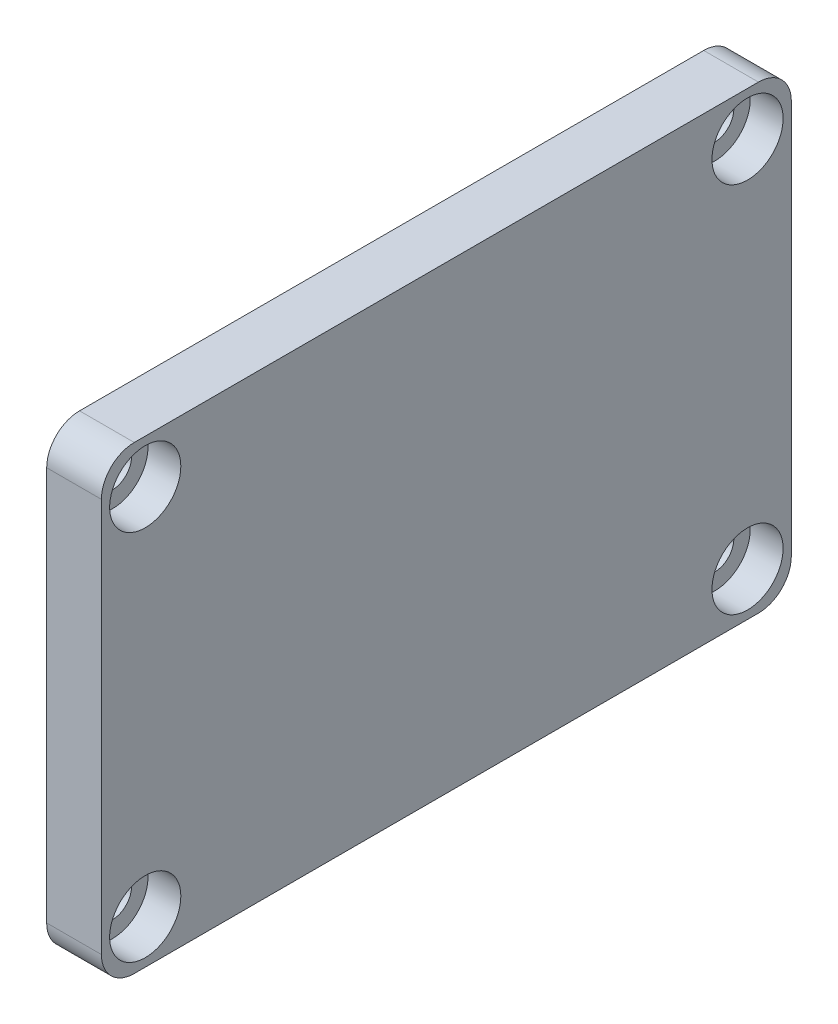
ISO-10303-21;
HEADER;
FILE_DESCRIPTION(('STEP AP214'),'2;1');
FILE_NAME('part.step','',(''),(''),'','','');
FILE_SCHEMA(('AUTOMOTIVE_DESIGN { 1 0 10303 214 1 1 1 1 }'));
ENDSEC;
DATA;
#1=APPLICATION_CONTEXT('core data for automotive mechanical design processes');
#2=APPLICATION_PROTOCOL_DEFINITION('international standard','automotive_design',2000,#1);
#3=PRODUCT_CONTEXT('',#1,'mechanical');
#4=PRODUCT('Part','Part','',(#3));
#5=PRODUCT_RELATED_PRODUCT_CATEGORY('part','',(#4));
#6=PRODUCT_DEFINITION_FORMATION('','',#4);
#7=PRODUCT_DEFINITION_CONTEXT('part definition',#1,'design');
#8=PRODUCT_DEFINITION('design','',#6,#7);
#9=PRODUCT_DEFINITION_SHAPE('','',#8);
#10=(LENGTH_UNIT() NAMED_UNIT(*) SI_UNIT(.MILLI.,.METRE.));
#11=(NAMED_UNIT(*) PLANE_ANGLE_UNIT() SI_UNIT($,.RADIAN.));
#12=(NAMED_UNIT(*) SI_UNIT($,.STERADIAN.) SOLID_ANGLE_UNIT());
#13=UNCERTAINTY_MEASURE_WITH_UNIT(LENGTH_MEASURE(1.E-05),#10,'distance_accuracy_value','');
#14=(GEOMETRIC_REPRESENTATION_CONTEXT(3) GLOBAL_UNCERTAINTY_ASSIGNED_CONTEXT((#13)) GLOBAL_UNIT_ASSIGNED_CONTEXT((#10,
#11,#12)) REPRESENTATION_CONTEXT('',''));
#15=CARTESIAN_POINT('',(0.,0.,0.));
#16=DIRECTION('',(0.,0.,1.));
#17=DIRECTION('',(1.,0.,0.));
#18=AXIS2_PLACEMENT_3D('',#15,#16,#17);
#19=CARTESIAN_POINT('',(0.,-17.,27.5));
#20=DIRECTION('',(1.,0.,0.));
#21=DIRECTION('',(0.,0.,-1.));
#22=AXIS2_PLACEMENT_3D('',#19,#20,#21);
#23=CYLINDRICAL_SURFACE('',#22,1.75);
#24=CARTESIAN_POINT('',(0.,-17.,27.5));
#25=DIRECTION('',(1.,0.,0.));
#26=DIRECTION('',(0.,0.,-1.));
#27=AXIS2_PLACEMENT_3D('',#24,#25,#26);
#28=CIRCLE('',#27,1.75);
#29=CARTESIAN_POINT('',(0.,-17.,25.75));
#30=VERTEX_POINT('',#29);
#31=EDGE_CURVE('E148',#30,#30,#28,.T.);
#32=ORIENTED_EDGE('',*,*,#31,.F.);
#33=EDGE_LOOP('',(#32));
#34=FACE_BOUND('',#33,.T.);
#35=CARTESIAN_POINT('',(2.,-17.,27.5));
#36=DIRECTION('',(1.,0.,0.));
#37=DIRECTION('',(0.,0.,-1.));
#38=AXIS2_PLACEMENT_3D('',#35,#36,#37);
#39=CIRCLE('',#38,1.75);
#40=CARTESIAN_POINT('',(2.,-17.,25.75));
#41=VERTEX_POINT('',#40);
#42=EDGE_CURVE('E50',#41,#41,#39,.F.);
#43=ORIENTED_EDGE('',*,*,#42,.F.);
#44=EDGE_LOOP('',(#43));
#45=FACE_BOUND('',#44,.T.);
#46=ADVANCED_FACE('F43',(#34,#45),#23,.F.);
#47=CARTESIAN_POINT('',(0.,17.,27.5));
#48=DIRECTION('',(1.,0.,0.));
#49=DIRECTION('',(0.,0.,-1.));
#50=AXIS2_PLACEMENT_3D('',#47,#48,#49);
#51=CYLINDRICAL_SURFACE('',#50,1.75);
#52=CARTESIAN_POINT('',(0.,17.,27.5));
#53=DIRECTION('',(1.,0.,0.));
#54=DIRECTION('',(0.,0.,-1.));
#55=AXIS2_PLACEMENT_3D('',#52,#53,#54);
#56=CIRCLE('',#55,1.75);
#57=CARTESIAN_POINT('',(0.,17.,25.75));
#58=VERTEX_POINT('',#57);
#59=EDGE_CURVE('E188',#58,#58,#56,.T.);
#60=ORIENTED_EDGE('',*,*,#59,.F.);
#61=EDGE_LOOP('',(#60));
#62=FACE_BOUND('',#61,.T.);
#63=CARTESIAN_POINT('',(2.,17.,27.5));
#64=DIRECTION('',(1.,0.,0.));
#65=DIRECTION('',(0.,0.,-1.));
#66=AXIS2_PLACEMENT_3D('',#63,#64,#65);
#67=CIRCLE('',#66,1.75);
#68=CARTESIAN_POINT('',(2.,17.,25.75));
#69=VERTEX_POINT('',#68);
#70=EDGE_CURVE('E172',#69,#69,#67,.F.);
#71=ORIENTED_EDGE('',*,*,#70,.F.);
#72=EDGE_LOOP('',(#71));
#73=FACE_BOUND('',#72,.T.);
#74=ADVANCED_FACE('F227',(#62,#73),#51,.F.);
#75=CARTESIAN_POINT('',(0.,17.,-27.5));
#76=DIRECTION('',(1.,0.,0.));
#77=DIRECTION('',(0.,0.,-1.));
#78=AXIS2_PLACEMENT_3D('',#75,#76,#77);
#79=CYLINDRICAL_SURFACE('',#78,1.75);
#80=CARTESIAN_POINT('',(0.,17.,-27.5));
#81=DIRECTION('',(1.,0.,0.));
#82=DIRECTION('',(0.,0.,-1.));
#83=AXIS2_PLACEMENT_3D('',#80,#81,#82);
#84=CIRCLE('',#83,1.75);
#85=CARTESIAN_POINT('',(0.,17.,-29.25));
#86=VERTEX_POINT('',#85);
#87=EDGE_CURVE('E184',#86,#86,#84,.T.);
#88=ORIENTED_EDGE('',*,*,#87,.F.);
#89=EDGE_LOOP('',(#88));
#90=FACE_BOUND('',#89,.T.);
#91=CARTESIAN_POINT('',(2.,17.,-27.5));
#92=DIRECTION('',(1.,0.,0.));
#93=DIRECTION('',(0.,0.,-1.));
#94=AXIS2_PLACEMENT_3D('',#91,#92,#93);
#95=CIRCLE('',#94,1.75);
#96=CARTESIAN_POINT('',(2.,17.,-29.25));
#97=VERTEX_POINT('',#96);
#98=EDGE_CURVE('E171',#97,#97,#95,.F.);
#99=ORIENTED_EDGE('',*,*,#98,.F.);
#100=EDGE_LOOP('',(#99));
#101=FACE_BOUND('',#100,.T.);
#102=ADVANCED_FACE('F237',(#90,#101),#79,.F.);
#103=CARTESIAN_POINT('',(0.,-17.,-27.5));
#104=DIRECTION('',(1.,0.,0.));
#105=DIRECTION('',(0.,0.,-1.));
#106=AXIS2_PLACEMENT_3D('',#103,#104,#105);
#107=CYLINDRICAL_SURFACE('',#106,1.75);
#108=CARTESIAN_POINT('',(0.,-17.,-27.5));
#109=DIRECTION('',(1.,0.,0.));
#110=DIRECTION('',(0.,0.,-1.));
#111=AXIS2_PLACEMENT_3D('',#108,#109,#110);
#112=CIRCLE('',#111,1.75);
#113=CARTESIAN_POINT('',(0.,-17.,-29.25));
#114=VERTEX_POINT('',#113);
#115=EDGE_CURVE('E178',#114,#114,#112,.T.);
#116=ORIENTED_EDGE('',*,*,#115,.F.);
#117=EDGE_LOOP('',(#116));
#118=FACE_BOUND('',#117,.T.);
#119=CARTESIAN_POINT('',(2.,-17.,-27.5));
#120=DIRECTION('',(1.,0.,0.));
#121=DIRECTION('',(0.,0.,-1.));
#122=AXIS2_PLACEMENT_3D('',#119,#120,#121);
#123=CIRCLE('',#122,1.75);
#124=CARTESIAN_POINT('',(2.,-17.,-29.25));
#125=VERTEX_POINT('',#124);
#126=EDGE_CURVE('E166',#125,#125,#123,.F.);
#127=ORIENTED_EDGE('',*,*,#126,.F.);
#128=EDGE_LOOP('',(#127));
#129=FACE_BOUND('',#128,.T.);
#130=ADVANCED_FACE('F241',(#118,#129),#107,.F.);
#131=CARTESIAN_POINT('',(5.,18.,28.5));
#132=DIRECTION('',(-1.,0.,0.));
#133=DIRECTION('',(0.,0.,1.));
#134=AXIS2_PLACEMENT_3D('',#131,#132,#133);
#135=CYLINDRICAL_SURFACE('',#134,3.);
#136=CARTESIAN_POINT('',(0.,18.,28.5));
#137=DIRECTION('',(1.,0.,0.));
#138=DIRECTION('',(0.,0.,-1.));
#139=AXIS2_PLACEMENT_3D('',#136,#137,#138);
#140=CIRCLE('',#139,3.);
#141=CARTESIAN_POINT('',(0.,21.,28.5));
#142=VERTEX_POINT('',#141);
#143=CARTESIAN_POINT('',(0.,18.,31.5));
#144=VERTEX_POINT('',#143);
#145=EDGE_CURVE('E142',#142,#144,#140,.T.);
#146=ORIENTED_EDGE('',*,*,#145,.T.);
#147=DIRECTION('',(-1.,0.,0.));
#148=VECTOR('',#147,1.);
#149=CARTESIAN_POINT('',(5.,18.,31.5));
#150=LINE('',#149,#148);
#151=CARTESIAN_POINT('',(5.,18.,31.5));
#152=VERTEX_POINT('',#151);
#153=EDGE_CURVE('E11',#152,#144,#150,.T.);
#154=ORIENTED_EDGE('',*,*,#153,.F.);
#155=CARTESIAN_POINT('',(5.,18.,28.5));
#156=DIRECTION('',(1.,0.,0.));
#157=DIRECTION('',(0.,0.,-1.));
#158=AXIS2_PLACEMENT_3D('',#155,#156,#157);
#159=CIRCLE('',#158,3.);
#160=CARTESIAN_POINT('',(5.,21.,28.5));
#161=VERTEX_POINT('',#160);
#162=EDGE_CURVE('E160',#161,#152,#159,.T.);
#163=ORIENTED_EDGE('',*,*,#162,.F.);
#164=DIRECTION('',(-1.,0.,0.));
#165=VECTOR('',#164,1.);
#166=CARTESIAN_POINT('',(5.,21.,28.5));
#167=LINE('',#166,#165);
#168=EDGE_CURVE('E139',#161,#142,#167,.T.);
#169=ORIENTED_EDGE('',*,*,#168,.T.);
#170=EDGE_LOOP('',(#146,#154,#163,#169));
#171=FACE_BOUND('',#170,.T.);
#172=ADVANCED_FACE('F44',(#171),#135,.T.);
#173=CARTESIAN_POINT('',(5.,-18.,31.5));
#174=DIRECTION('',(0.,0.,-1.));
#175=DIRECTION('',(-1.,0.,0.));
#176=AXIS2_PLACEMENT_3D('',#173,#174,#175);
#177=PLANE('',#176);
#178=DIRECTION('',(0.,-1.,0.));
#179=VECTOR('',#178,1.);
#180=CARTESIAN_POINT('',(0.,-18.,31.5));
#181=LINE('',#180,#179);
#182=CARTESIAN_POINT('',(0.,-18.,31.5));
#183=VERTEX_POINT('',#182);
#184=EDGE_CURVE('E144',#144,#183,#181,.T.);
#185=ORIENTED_EDGE('',*,*,#184,.T.);
#186=DIRECTION('',(-1.,0.,0.));
#187=VECTOR('',#186,1.);
#188=CARTESIAN_POINT('',(5.,-18.,31.5));
#189=LINE('',#188,#187);
#190=CARTESIAN_POINT('',(5.,-18.,31.5));
#191=VERTEX_POINT('',#190);
#192=EDGE_CURVE('E52',#191,#183,#189,.T.);
#193=ORIENTED_EDGE('',*,*,#192,.F.);
#194=DIRECTION('',(0.,-1.,0.));
#195=VECTOR('',#194,1.);
#196=CARTESIAN_POINT('',(5.,-18.,31.5));
#197=LINE('',#196,#195);
#198=EDGE_CURVE('E104',#152,#191,#197,.T.);
#199=ORIENTED_EDGE('',*,*,#198,.F.);
#200=ORIENTED_EDGE('',*,*,#153,.T.);
#201=EDGE_LOOP('',(#185,#193,#199,#200));
#202=FACE_BOUND('',#201,.T.);
#203=ADVANCED_FACE('F444',(#202),#177,.F.);
#204=CARTESIAN_POINT('',(5.,-18.,28.5));
#205=DIRECTION('',(-1.,0.,0.));
#206=DIRECTION('',(0.,0.,1.));
#207=AXIS2_PLACEMENT_3D('',#204,#205,#206);
#208=CYLINDRICAL_SURFACE('',#207,3.);
#209=CARTESIAN_POINT('',(0.,-18.,28.5));
#210=DIRECTION('',(1.,0.,0.));
#211=DIRECTION('',(0.,0.,1.));
#212=AXIS2_PLACEMENT_3D('',#209,#210,#211);
#213=CIRCLE('',#212,3.);
#214=CARTESIAN_POINT('',(0.,-21.,28.5));
#215=VERTEX_POINT('',#214);
#216=EDGE_CURVE('E146',#183,#215,#213,.T.);
#217=ORIENTED_EDGE('',*,*,#216,.T.);
#218=DIRECTION('',(-1.,0.,0.));
#219=VECTOR('',#218,1.);
#220=CARTESIAN_POINT('',(5.,-21.,28.5));
#221=LINE('',#220,#219);
#222=CARTESIAN_POINT('',(5.,-21.,28.5));
#223=VERTEX_POINT('',#222);
#224=EDGE_CURVE('E163',#223,#215,#221,.T.);
#225=ORIENTED_EDGE('',*,*,#224,.F.);
#226=CARTESIAN_POINT('',(5.,-18.,28.5));
#227=DIRECTION('',(1.,0.,0.));
#228=DIRECTION('',(0.,0.,1.));
#229=AXIS2_PLACEMENT_3D('',#226,#227,#228);
#230=CIRCLE('',#229,3.);
#231=EDGE_CURVE('E197',#191,#223,#230,.T.);
#232=ORIENTED_EDGE('',*,*,#231,.F.);
#233=ORIENTED_EDGE('',*,*,#192,.T.);
#234=EDGE_LOOP('',(#217,#225,#232,#233));
#235=FACE_BOUND('',#234,.T.);
#236=ADVANCED_FACE('F432',(#235),#208,.T.);
#237=CARTESIAN_POINT('',(5.,-21.,-28.5));
#238=DIRECTION('',(0.,1.,0.));
#239=DIRECTION('',(0.,0.,1.));
#240=AXIS2_PLACEMENT_3D('',#237,#238,#239);
#241=PLANE('',#240);
#242=DIRECTION('',(0.,0.,-1.));
#243=VECTOR('',#242,1.);
#244=CARTESIAN_POINT('',(0.,-21.,-28.5));
#245=LINE('',#244,#243);
#246=CARTESIAN_POINT('',(0.,-21.,-28.5));
#247=VERTEX_POINT('',#246);
#248=EDGE_CURVE('E147',#215,#247,#245,.T.);
#249=ORIENTED_EDGE('',*,*,#248,.T.);
#250=DIRECTION('',(-1.,0.,0.));
#251=VECTOR('',#250,1.);
#252=CARTESIAN_POINT('',(5.,-21.,-28.5));
#253=LINE('',#252,#251);
#254=CARTESIAN_POINT('',(5.,-21.,-28.5));
#255=VERTEX_POINT('',#254);
#256=EDGE_CURVE('E161',#255,#247,#253,.T.);
#257=ORIENTED_EDGE('',*,*,#256,.F.);
#258=DIRECTION('',(0.,0.,-1.));
#259=VECTOR('',#258,1.);
#260=CARTESIAN_POINT('',(5.,-21.,-28.5));
#261=LINE('',#260,#259);
#262=EDGE_CURVE('E200',#223,#255,#261,.T.);
#263=ORIENTED_EDGE('',*,*,#262,.F.);
#264=ORIENTED_EDGE('',*,*,#224,.T.);
#265=EDGE_LOOP('',(#249,#257,#263,#264));
#266=FACE_BOUND('',#265,.T.);
#267=ADVANCED_FACE('F202',(#266),#241,.F.);
#268=CARTESIAN_POINT('',(5.,-18.,-28.5));
#269=DIRECTION('',(-1.,0.,0.));
#270=DIRECTION('',(0.,0.,1.));
#271=AXIS2_PLACEMENT_3D('',#268,#269,#270);
#272=CYLINDRICAL_SURFACE('',#271,3.);
#273=CARTESIAN_POINT('',(0.,-18.,-28.5));
#274=DIRECTION('',(1.,0.,0.));
#275=DIRECTION('',(0.,0.,1.));
#276=AXIS2_PLACEMENT_3D('',#273,#274,#275);
#277=CIRCLE('',#276,3.);
#278=CARTESIAN_POINT('',(0.,-18.,-31.5));
#279=VERTEX_POINT('',#278);
#280=EDGE_CURVE('E155',#247,#279,#277,.T.);
#281=ORIENTED_EDGE('',*,*,#280,.T.);
#282=DIRECTION('',(-1.,0.,0.));
#283=VECTOR('',#282,1.);
#284=CARTESIAN_POINT('',(5.,-18.,-31.5));
#285=LINE('',#284,#283);
#286=CARTESIAN_POINT('',(5.,-18.,-31.5));
#287=VERTEX_POINT('',#286);
#288=EDGE_CURVE('E135',#287,#279,#285,.T.);
#289=ORIENTED_EDGE('',*,*,#288,.F.);
#290=CARTESIAN_POINT('',(5.,-18.,-28.5));
#291=DIRECTION('',(1.,0.,0.));
#292=DIRECTION('',(0.,0.,1.));
#293=AXIS2_PLACEMENT_3D('',#290,#291,#292);
#294=CIRCLE('',#293,3.);
#295=EDGE_CURVE('E121',#255,#287,#294,.T.);
#296=ORIENTED_EDGE('',*,*,#295,.F.);
#297=ORIENTED_EDGE('',*,*,#256,.T.);
#298=EDGE_LOOP('',(#281,#289,#296,#297));
#299=FACE_BOUND('',#298,.T.);
#300=ADVANCED_FACE('F207',(#299),#272,.T.);
#301=CARTESIAN_POINT('',(5.,-18.,-31.5));
#302=DIRECTION('',(0.,0.,1.));
#303=DIRECTION('',(1.,0.,0.));
#304=AXIS2_PLACEMENT_3D('',#301,#302,#303);
#305=PLANE('',#304);
#306=DIRECTION('',(0.,1.,0.));
#307=VECTOR('',#306,1.);
#308=CARTESIAN_POINT('',(0.,-18.,-31.5));
#309=LINE('',#308,#307);
#310=CARTESIAN_POINT('',(0.,18.,-31.5));
#311=VERTEX_POINT('',#310);
#312=EDGE_CURVE('E131',#279,#311,#309,.T.);
#313=ORIENTED_EDGE('',*,*,#312,.T.);
#314=DIRECTION('',(-1.,0.,0.));
#315=VECTOR('',#314,1.);
#316=CARTESIAN_POINT('',(5.,18.,-31.5));
#317=LINE('',#316,#315);
#318=CARTESIAN_POINT('',(5.,18.,-31.5));
#319=VERTEX_POINT('',#318);
#320=EDGE_CURVE('E129',#319,#311,#317,.T.);
#321=ORIENTED_EDGE('',*,*,#320,.F.);
#322=DIRECTION('',(0.,1.,0.));
#323=VECTOR('',#322,1.);
#324=CARTESIAN_POINT('',(5.,-18.,-31.5));
#325=LINE('',#324,#323);
#326=EDGE_CURVE('E120',#287,#319,#325,.T.);
#327=ORIENTED_EDGE('',*,*,#326,.F.);
#328=ORIENTED_EDGE('',*,*,#288,.T.);
#329=EDGE_LOOP('',(#313,#321,#327,#328));
#330=FACE_BOUND('',#329,.T.);
#331=ADVANCED_FACE('F128',(#330),#305,.F.);
#332=CARTESIAN_POINT('',(5.,18.,-28.5));
#333=DIRECTION('',(-1.,0.,0.));
#334=DIRECTION('',(0.,0.,1.));
#335=AXIS2_PLACEMENT_3D('',#332,#333,#334);
#336=CYLINDRICAL_SURFACE('',#335,3.);
#337=CARTESIAN_POINT('',(0.,18.,-28.5));
#338=DIRECTION('',(1.,0.,0.));
#339=DIRECTION('',(0.,0.,-1.));
#340=AXIS2_PLACEMENT_3D('',#337,#338,#339);
#341=CIRCLE('',#340,3.);
#342=CARTESIAN_POINT('',(0.,21.,-28.5));
#343=VERTEX_POINT('',#342);
#344=EDGE_CURVE('E93',#311,#343,#341,.T.);
#345=ORIENTED_EDGE('',*,*,#344,.T.);
#346=DIRECTION('',(-1.,0.,0.));
#347=VECTOR('',#346,1.);
#348=CARTESIAN_POINT('',(5.,21.,-28.5));
#349=LINE('',#348,#347);
#350=CARTESIAN_POINT('',(5.,21.,-28.5));
#351=VERTEX_POINT('',#350);
#352=EDGE_CURVE('E133',#351,#343,#349,.T.);
#353=ORIENTED_EDGE('',*,*,#352,.F.);
#354=CARTESIAN_POINT('',(5.,18.,-28.5));
#355=DIRECTION('',(1.,0.,0.));
#356=DIRECTION('',(0.,0.,-1.));
#357=AXIS2_PLACEMENT_3D('',#354,#355,#356);
#358=CIRCLE('',#357,3.);
#359=EDGE_CURVE('E125',#319,#351,#358,.T.);
#360=ORIENTED_EDGE('',*,*,#359,.F.);
#361=ORIENTED_EDGE('',*,*,#320,.T.);
#362=EDGE_LOOP('',(#345,#353,#360,#361));
#363=FACE_BOUND('',#362,.T.);
#364=ADVANCED_FACE('F137',(#363),#336,.T.);
#365=CARTESIAN_POINT('',(5.,21.,-28.5));
#366=DIRECTION('',(0.,-1.,0.));
#367=DIRECTION('',(0.,0.,-1.));
#368=AXIS2_PLACEMENT_3D('',#365,#366,#367);
#369=PLANE('',#368);
#370=DIRECTION('',(0.,0.,1.));
#371=VECTOR('',#370,1.);
#372=CARTESIAN_POINT('',(0.,21.,-28.5));
#373=LINE('',#372,#371);
#374=EDGE_CURVE('E100',#343,#142,#373,.T.);
#375=ORIENTED_EDGE('',*,*,#374,.T.);
#376=ORIENTED_EDGE('',*,*,#168,.F.);
#377=DIRECTION('',(0.,0.,1.));
#378=VECTOR('',#377,1.);
#379=CARTESIAN_POINT('',(5.,21.,-28.5));
#380=LINE('',#379,#378);
#381=EDGE_CURVE('E61',#351,#161,#380,.T.);
#382=ORIENTED_EDGE('',*,*,#381,.F.);
#383=ORIENTED_EDGE('',*,*,#352,.T.);
#384=EDGE_LOOP('',(#375,#376,#382,#383));
#385=FACE_BOUND('',#384,.T.);
#386=ADVANCED_FACE('F220',(#385),#369,.F.);
#387=CARTESIAN_POINT('',(5.,18.,28.5));
#388=DIRECTION('',(1.,0.,0.));
#389=DIRECTION('',(0.,0.,-1.));
#390=AXIS2_PLACEMENT_3D('',#387,#388,#389);
#391=PLANE('',#390);
#392=CARTESIAN_POINT('',(5.,17.,-27.5));
#393=DIRECTION('',(1.,0.,0.));
#394=DIRECTION('',(0.,0.,-1.));
#395=AXIS2_PLACEMENT_3D('',#392,#393,#394);
#396=CIRCLE('',#395,3.25);
#397=CARTESIAN_POINT('',(5.,17.,-30.75));
#398=VERTEX_POINT('',#397);
#399=EDGE_CURVE('E261',#398,#398,#396,.T.);
#400=ORIENTED_EDGE('',*,*,#399,.F.);
#401=EDGE_LOOP('',(#400));
#402=FACE_BOUND('',#401,.T.);
#403=CARTESIAN_POINT('',(5.,-17.,27.5));
#404=DIRECTION('',(1.,0.,0.));
#405=DIRECTION('',(0.,0.,-1.));
#406=AXIS2_PLACEMENT_3D('',#403,#404,#405);
#407=CIRCLE('',#406,3.25);
#408=CARTESIAN_POINT('',(5.,-17.,24.25));
#409=VERTEX_POINT('',#408);
#410=EDGE_CURVE('E270',#409,#409,#407,.T.);
#411=ORIENTED_EDGE('',*,*,#410,.F.);
#412=EDGE_LOOP('',(#411));
#413=FACE_BOUND('',#412,.T.);
#414=CARTESIAN_POINT('',(5.,-17.,-27.5));
#415=DIRECTION('',(1.,0.,0.));
#416=DIRECTION('',(0.,0.,-1.));
#417=AXIS2_PLACEMENT_3D('',#414,#415,#416);
#418=CIRCLE('',#417,3.25);
#419=CARTESIAN_POINT('',(5.,-17.,-30.75));
#420=VERTEX_POINT('',#419);
#421=EDGE_CURVE('E268',#420,#420,#418,.T.);
#422=ORIENTED_EDGE('',*,*,#421,.F.);
#423=EDGE_LOOP('',(#422));
#424=FACE_BOUND('',#423,.T.);
#425=CARTESIAN_POINT('',(5.,17.,27.5));
#426=DIRECTION('',(1.,0.,0.));
#427=DIRECTION('',(0.,0.,-1.));
#428=AXIS2_PLACEMENT_3D('',#425,#426,#427);
#429=CIRCLE('',#428,3.25);
#430=CARTESIAN_POINT('',(5.,17.,24.25));
#431=VERTEX_POINT('',#430);
#432=EDGE_CURVE('E256',#431,#431,#429,.T.);
#433=ORIENTED_EDGE('',*,*,#432,.F.);
#434=EDGE_LOOP('',(#433));
#435=FACE_BOUND('',#434,.T.);
#436=ORIENTED_EDGE('',*,*,#162,.T.);
#437=ORIENTED_EDGE('',*,*,#198,.T.);
#438=ORIENTED_EDGE('',*,*,#231,.T.);
#439=ORIENTED_EDGE('',*,*,#262,.T.);
#440=ORIENTED_EDGE('',*,*,#295,.T.);
#441=ORIENTED_EDGE('',*,*,#326,.T.);
#442=ORIENTED_EDGE('',*,*,#359,.T.);
#443=ORIENTED_EDGE('',*,*,#381,.T.);
#444=EDGE_LOOP('',(#436,#437,#438,#439,#440,#441,#442,#443));
#445=FACE_BOUND('',#444,.T.);
#446=ADVANCED_FACE('F117',(#402,#413,#424,#435,#445),#391,.T.);
#447=CARTESIAN_POINT('',(0.,18.,28.5));
#448=DIRECTION('',(1.,0.,0.));
#449=DIRECTION('',(0.,0.,-1.));
#450=AXIS2_PLACEMENT_3D('',#447,#448,#449);
#451=PLANE('',#450);
#452=ORIENTED_EDGE('',*,*,#115,.T.);
#453=EDGE_LOOP('',(#452));
#454=FACE_BOUND('',#453,.T.);
#455=ORIENTED_EDGE('',*,*,#87,.T.);
#456=EDGE_LOOP('',(#455));
#457=FACE_BOUND('',#456,.T.);
#458=ORIENTED_EDGE('',*,*,#59,.T.);
#459=EDGE_LOOP('',(#458));
#460=FACE_BOUND('',#459,.T.);
#461=ORIENTED_EDGE('',*,*,#31,.T.);
#462=EDGE_LOOP('',(#461));
#463=FACE_BOUND('',#462,.T.);
#464=ORIENTED_EDGE('',*,*,#145,.F.);
#465=ORIENTED_EDGE('',*,*,#374,.F.);
#466=ORIENTED_EDGE('',*,*,#344,.F.);
#467=ORIENTED_EDGE('',*,*,#312,.F.);
#468=ORIENTED_EDGE('',*,*,#280,.F.);
#469=ORIENTED_EDGE('',*,*,#248,.F.);
#470=ORIENTED_EDGE('',*,*,#216,.F.);
#471=ORIENTED_EDGE('',*,*,#184,.F.);
#472=EDGE_LOOP('',(#464,#465,#466,#467,#468,#469,#470,#471));
#473=FACE_BOUND('',#472,.T.);
#474=ADVANCED_FACE('F215',(#454,#457,#460,#463,#473),#451,.F.);
#475=CARTESIAN_POINT('',(2.,-17.,-27.5));
#476=DIRECTION('',(1.,0.,0.));
#477=DIRECTION('',(0.,0.,-1.));
#478=AXIS2_PLACEMENT_3D('',#475,#476,#477);
#479=PLANE('',#478);
#480=CARTESIAN_POINT('',(2.,-17.,-27.5));
#481=DIRECTION('',(1.,0.,0.));
#482=DIRECTION('',(0.,0.,-1.));
#483=AXIS2_PLACEMENT_3D('',#480,#481,#482);
#484=CIRCLE('',#483,3.25);
#485=CARTESIAN_POINT('',(2.,-17.,-30.75));
#486=VERTEX_POINT('',#485);
#487=EDGE_CURVE('E277',#486,#486,#484,.T.);
#488=ORIENTED_EDGE('',*,*,#487,.T.);
#489=EDGE_LOOP('',(#488));
#490=FACE_BOUND('',#489,.T.);
#491=ORIENTED_EDGE('',*,*,#126,.T.);
#492=EDGE_LOOP('',(#491));
#493=FACE_BOUND('',#492,.T.);
#494=ADVANCED_FACE('F243',(#490,#493),#479,.T.);
#495=CARTESIAN_POINT('',(2.,-17.,-27.5));
#496=DIRECTION('',(1.,0.,0.));
#497=DIRECTION('',(0.,0.,-1.));
#498=AXIS2_PLACEMENT_3D('',#495,#496,#497);
#499=CYLINDRICAL_SURFACE('',#498,3.25);
#500=ORIENTED_EDGE('',*,*,#487,.F.);
#501=EDGE_LOOP('',(#500));
#502=FACE_BOUND('',#501,.T.);
#503=ORIENTED_EDGE('',*,*,#421,.T.);
#504=EDGE_LOOP('',(#503));
#505=FACE_BOUND('',#504,.T.);
#506=ADVANCED_FACE('F249',(#502,#505),#499,.F.);
#507=CARTESIAN_POINT('',(2.,17.,-27.5));
#508=DIRECTION('',(1.,0.,0.));
#509=DIRECTION('',(0.,0.,-1.));
#510=AXIS2_PLACEMENT_3D('',#507,#508,#509);
#511=PLANE('',#510);
#512=CARTESIAN_POINT('',(2.,17.,-27.5));
#513=DIRECTION('',(1.,0.,0.));
#514=DIRECTION('',(0.,0.,-1.));
#515=AXIS2_PLACEMENT_3D('',#512,#513,#514);
#516=CIRCLE('',#515,3.25);
#517=CARTESIAN_POINT('',(2.,17.,-30.75));
#518=VERTEX_POINT('',#517);
#519=EDGE_CURVE('E271',#518,#518,#516,.T.);
#520=ORIENTED_EDGE('',*,*,#519,.T.);
#521=EDGE_LOOP('',(#520));
#522=FACE_BOUND('',#521,.T.);
#523=ORIENTED_EDGE('',*,*,#98,.T.);
#524=EDGE_LOOP('',(#523));
#525=FACE_BOUND('',#524,.T.);
#526=ADVANCED_FACE('F315',(#522,#525),#511,.T.);
#527=CARTESIAN_POINT('',(2.,17.,-27.5));
#528=DIRECTION('',(1.,0.,0.));
#529=DIRECTION('',(0.,0.,-1.));
#530=AXIS2_PLACEMENT_3D('',#527,#528,#529);
#531=CYLINDRICAL_SURFACE('',#530,3.25);
#532=ORIENTED_EDGE('',*,*,#519,.F.);
#533=EDGE_LOOP('',(#532));
#534=FACE_BOUND('',#533,.T.);
#535=ORIENTED_EDGE('',*,*,#399,.T.);
#536=EDGE_LOOP('',(#535));
#537=FACE_BOUND('',#536,.T.);
#538=ADVANCED_FACE('F298',(#534,#537),#531,.F.);
#539=CARTESIAN_POINT('',(2.,17.,27.5));
#540=DIRECTION('',(1.,0.,0.));
#541=DIRECTION('',(0.,0.,-1.));
#542=AXIS2_PLACEMENT_3D('',#539,#540,#541);
#543=PLANE('',#542);
#544=CARTESIAN_POINT('',(2.,17.,27.5));
#545=DIRECTION('',(1.,0.,0.));
#546=DIRECTION('',(0.,0.,-1.));
#547=AXIS2_PLACEMENT_3D('',#544,#545,#546);
#548=CIRCLE('',#547,3.25);
#549=CARTESIAN_POINT('',(2.,17.,24.25));
#550=VERTEX_POINT('',#549);
#551=EDGE_CURVE('E175',#550,#550,#548,.T.);
#552=ORIENTED_EDGE('',*,*,#551,.T.);
#553=EDGE_LOOP('',(#552));
#554=FACE_BOUND('',#553,.T.);
#555=ORIENTED_EDGE('',*,*,#70,.T.);
#556=EDGE_LOOP('',(#555));
#557=FACE_BOUND('',#556,.T.);
#558=ADVANCED_FACE('F286',(#554,#557),#543,.T.);
#559=CARTESIAN_POINT('',(2.,17.,27.5));
#560=DIRECTION('',(1.,0.,0.));
#561=DIRECTION('',(0.,0.,-1.));
#562=AXIS2_PLACEMENT_3D('',#559,#560,#561);
#563=CYLINDRICAL_SURFACE('',#562,3.25);
#564=ORIENTED_EDGE('',*,*,#551,.F.);
#565=EDGE_LOOP('',(#564));
#566=FACE_BOUND('',#565,.T.);
#567=ORIENTED_EDGE('',*,*,#432,.T.);
#568=EDGE_LOOP('',(#567));
#569=FACE_BOUND('',#568,.T.);
#570=ADVANCED_FACE('F287',(#566,#569),#563,.F.);
#571=CARTESIAN_POINT('',(2.,-17.,27.5));
#572=DIRECTION('',(1.,0.,0.));
#573=DIRECTION('',(0.,0.,-1.));
#574=AXIS2_PLACEMENT_3D('',#571,#572,#573);
#575=PLANE('',#574);
#576=CARTESIAN_POINT('',(2.,-17.,27.5));
#577=DIRECTION('',(1.,0.,0.));
#578=DIRECTION('',(0.,0.,-1.));
#579=AXIS2_PLACEMENT_3D('',#576,#577,#578);
#580=CIRCLE('',#579,3.25);
#581=CARTESIAN_POINT('',(2.,-17.,24.25));
#582=VERTEX_POINT('',#581);
#583=EDGE_CURVE('E262',#582,#582,#580,.T.);
#584=ORIENTED_EDGE('',*,*,#583,.T.);
#585=EDGE_LOOP('',(#584));
#586=FACE_BOUND('',#585,.T.);
#587=ORIENTED_EDGE('',*,*,#42,.T.);
#588=EDGE_LOOP('',(#587));
#589=FACE_BOUND('',#588,.T.);
#590=ADVANCED_FACE('F289',(#586,#589),#575,.T.);
#591=CARTESIAN_POINT('',(2.,-17.,27.5));
#592=DIRECTION('',(1.,0.,0.));
#593=DIRECTION('',(0.,0.,-1.));
#594=AXIS2_PLACEMENT_3D('',#591,#592,#593);
#595=CYLINDRICAL_SURFACE('',#594,3.25);
#596=ORIENTED_EDGE('',*,*,#583,.F.);
#597=EDGE_LOOP('',(#596));
#598=FACE_BOUND('',#597,.T.);
#599=ORIENTED_EDGE('',*,*,#410,.T.);
#600=EDGE_LOOP('',(#599));
#601=FACE_BOUND('',#600,.T.);
#602=ADVANCED_FACE('F299',(#598,#601),#595,.F.);
#603=CLOSED_SHELL('',(#46,#74,#102,#130,#172,#203,#236,#267,#300,#331,#364,#386,#446,#474,#494,
#506,#526,#538,#558,#570,#590,#602));
#604=MANIFOLD_SOLID_BREP('B2',#603);
#605=ADVANCED_BREP_SHAPE_REPRESENTATION('',(#18,#604),#14);
#606=SHAPE_DEFINITION_REPRESENTATION(#9,#605);
ENDSEC;
END-ISO-10303-21;
